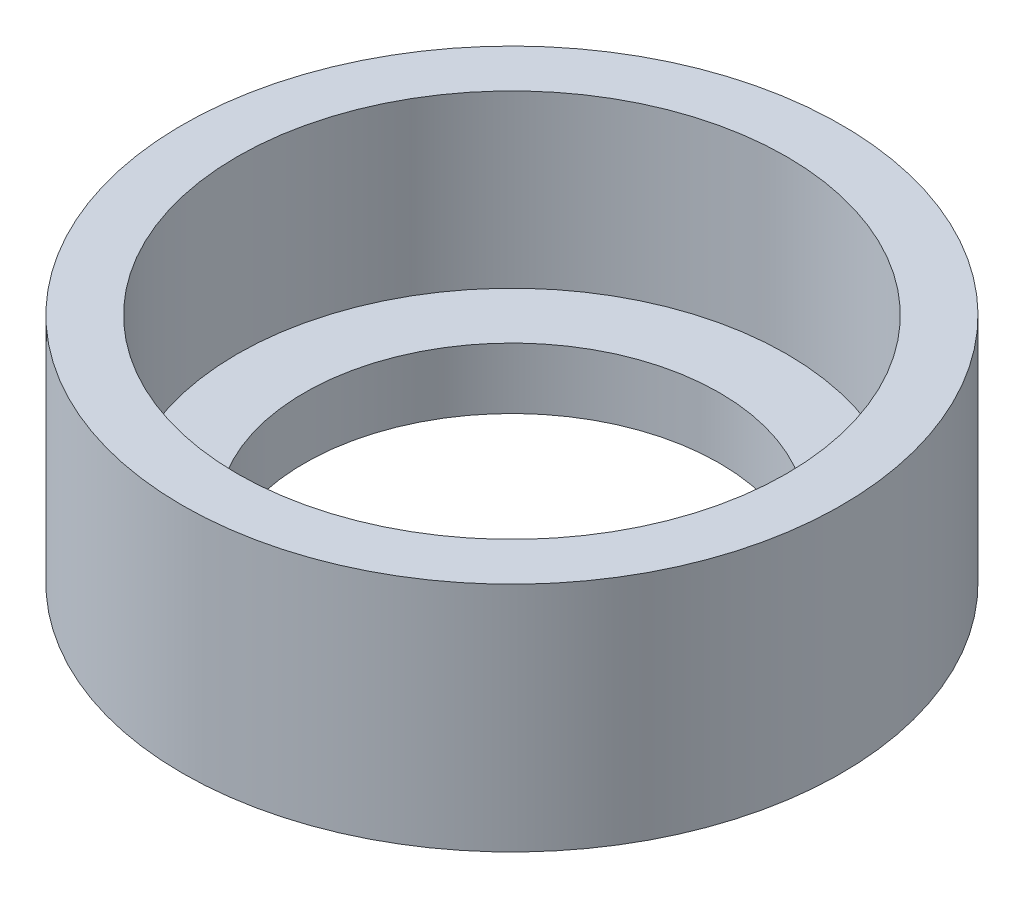
ISO-10303-21;
HEADER;
FILE_DESCRIPTION(('STEP AP214'),'2;1');
FILE_NAME('part.step','',(''),(''),'','','');
FILE_SCHEMA(('AUTOMOTIVE_DESIGN { 1 0 10303 214 1 1 1 1 }'));
ENDSEC;
DATA;
#1=APPLICATION_CONTEXT('core data for automotive mechanical design processes');
#2=APPLICATION_PROTOCOL_DEFINITION('international standard','automotive_design',2000,#1);
#3=PRODUCT_CONTEXT('',#1,'mechanical');
#4=PRODUCT('Part','Part','',(#3));
#5=PRODUCT_RELATED_PRODUCT_CATEGORY('part','',(#4));
#6=PRODUCT_DEFINITION_FORMATION('','',#4);
#7=PRODUCT_DEFINITION_CONTEXT('part definition',#1,'design');
#8=PRODUCT_DEFINITION('design','',#6,#7);
#9=PRODUCT_DEFINITION_SHAPE('','',#8);
#10=(LENGTH_UNIT() NAMED_UNIT(*) SI_UNIT(.MILLI.,.METRE.));
#11=(NAMED_UNIT(*) PLANE_ANGLE_UNIT() SI_UNIT($,.RADIAN.));
#12=(NAMED_UNIT(*) SI_UNIT($,.STERADIAN.) SOLID_ANGLE_UNIT());
#13=UNCERTAINTY_MEASURE_WITH_UNIT(LENGTH_MEASURE(1.E-05),#10,'distance_accuracy_value','');
#14=(GEOMETRIC_REPRESENTATION_CONTEXT(3) GLOBAL_UNCERTAINTY_ASSIGNED_CONTEXT((#13)) GLOBAL_UNIT_ASSIGNED_CONTEXT((#10,
#11,#12)) REPRESENTATION_CONTEXT('',''));
#15=CARTESIAN_POINT('',(0.,0.,0.));
#16=DIRECTION('',(0.,0.,1.));
#17=DIRECTION('',(1.,0.,0.));
#18=AXIS2_PLACEMENT_3D('',#15,#16,#17);
#19=CARTESIAN_POINT('',(0.,9.5,0.));
#20=DIRECTION('',(0.,-1.,0.));
#21=DIRECTION('',(0.,0.,-1.));
#22=AXIS2_PLACEMENT_3D('',#19,#20,#21);
#23=CYLINDRICAL_SURFACE('',#22,8.5);
#24=CARTESIAN_POINT('',(0.,0.,0.));
#25=DIRECTION('',(0.,1.,0.));
#26=DIRECTION('',(0.,0.,1.));
#27=AXIS2_PLACEMENT_3D('',#24,#25,#26);
#28=CIRCLE('',#27,8.5);
#29=CARTESIAN_POINT('',(0.,0.,8.5));
#30=VERTEX_POINT('',#29);
#31=EDGE_CURVE('E44',#30,#30,#28,.T.);
#32=ORIENTED_EDGE('',*,*,#31,.F.);
#33=EDGE_LOOP('',(#32));
#34=FACE_BOUND('',#33,.T.);
#35=CARTESIAN_POINT('',(0.,2.5,0.));
#36=DIRECTION('',(0.,1.,0.));
#37=DIRECTION('',(0.,0.,1.));
#38=AXIS2_PLACEMENT_3D('',#35,#36,#37);
#39=CIRCLE('',#38,8.5);
#40=CARTESIAN_POINT('',(0.,2.5,8.5));
#41=VERTEX_POINT('',#40);
#42=EDGE_CURVE('E35',#41,#41,#39,.T.);
#43=ORIENTED_EDGE('',*,*,#42,.T.);
#44=EDGE_LOOP('',(#43));
#45=FACE_BOUND('',#44,.T.);
#46=ADVANCED_FACE('F31',(#34,#45),#23,.F.);
#47=CARTESIAN_POINT('',(0.,9.5,0.));
#48=DIRECTION('',(0.,1.,0.));
#49=DIRECTION('',(0.,0.,1.));
#50=AXIS2_PLACEMENT_3D('',#47,#48,#49);
#51=PLANE('',#50);
#52=CARTESIAN_POINT('',(0.,9.5,0.));
#53=DIRECTION('',(0.,1.,0.));
#54=DIRECTION('',(0.,0.,1.));
#55=AXIS2_PLACEMENT_3D('',#52,#53,#54);
#56=CIRCLE('',#55,11.25);
#57=CARTESIAN_POINT('',(0.,9.5,11.25));
#58=VERTEX_POINT('',#57);
#59=EDGE_CURVE('E48',#58,#58,#56,.T.);
#60=ORIENTED_EDGE('',*,*,#59,.F.);
#61=EDGE_LOOP('',(#60));
#62=FACE_BOUND('',#61,.T.);
#63=CARTESIAN_POINT('',(0.,9.5,0.));
#64=DIRECTION('',(0.,1.,0.));
#65=DIRECTION('',(0.,0.,1.));
#66=AXIS2_PLACEMENT_3D('',#63,#64,#65);
#67=CIRCLE('',#66,13.5);
#68=CARTESIAN_POINT('',(0.,9.5,13.5));
#69=VERTEX_POINT('',#68);
#70=EDGE_CURVE('E10',#69,#69,#67,.T.);
#71=ORIENTED_EDGE('',*,*,#70,.T.);
#72=EDGE_LOOP('',(#71));
#73=FACE_BOUND('',#72,.T.);
#74=ADVANCED_FACE('F69',(#62,#73),#51,.T.);
#75=CARTESIAN_POINT('',(0.,0.,0.));
#76=DIRECTION('',(0.,1.,0.));
#77=DIRECTION('',(0.,0.,1.));
#78=AXIS2_PLACEMENT_3D('',#75,#76,#77);
#79=PLANE('',#78);
#80=CARTESIAN_POINT('',(0.,0.,0.));
#81=DIRECTION('',(0.,1.,0.));
#82=DIRECTION('',(0.,0.,1.));
#83=AXIS2_PLACEMENT_3D('',#80,#81,#82);
#84=CIRCLE('',#83,13.5);
#85=CARTESIAN_POINT('',(0.,0.,13.5));
#86=VERTEX_POINT('',#85);
#87=EDGE_CURVE('E39',#86,#86,#84,.T.);
#88=ORIENTED_EDGE('',*,*,#87,.F.);
#89=EDGE_LOOP('',(#88));
#90=FACE_BOUND('',#89,.T.);
#91=ORIENTED_EDGE('',*,*,#31,.T.);
#92=EDGE_LOOP('',(#91));
#93=FACE_BOUND('',#92,.T.);
#94=ADVANCED_FACE('F75',(#90,#93),#79,.F.);
#95=CARTESIAN_POINT('',(0.,9.5,0.));
#96=DIRECTION('',(0.,-1.,0.));
#97=DIRECTION('',(0.,0.,-1.));
#98=AXIS2_PLACEMENT_3D('',#95,#96,#97);
#99=CYLINDRICAL_SURFACE('',#98,13.5);
#100=ORIENTED_EDGE('',*,*,#70,.F.);
#101=EDGE_LOOP('',(#100));
#102=FACE_BOUND('',#101,.T.);
#103=ORIENTED_EDGE('',*,*,#87,.T.);
#104=EDGE_LOOP('',(#103));
#105=FACE_BOUND('',#104,.T.);
#106=ADVANCED_FACE('F33',(#102,#105),#99,.T.);
#107=CARTESIAN_POINT('',(0.,2.5,0.));
#108=DIRECTION('',(0.,1.,0.));
#109=DIRECTION('',(0.,0.,1.));
#110=AXIS2_PLACEMENT_3D('',#107,#108,#109);
#111=CYLINDRICAL_SURFACE('',#110,11.25);
#112=CARTESIAN_POINT('',(0.,2.5,0.));
#113=DIRECTION('',(0.,1.,0.));
#114=DIRECTION('',(0.,0.,1.));
#115=AXIS2_PLACEMENT_3D('',#112,#113,#114);
#116=CIRCLE('',#115,11.25);
#117=CARTESIAN_POINT('',(0.,2.5,11.25));
#118=VERTEX_POINT('',#117);
#119=EDGE_CURVE('E51',#118,#118,#116,.T.);
#120=ORIENTED_EDGE('',*,*,#119,.F.);
#121=EDGE_LOOP('',(#120));
#122=FACE_BOUND('',#121,.T.);
#123=ORIENTED_EDGE('',*,*,#59,.T.);
#124=EDGE_LOOP('',(#123));
#125=FACE_BOUND('',#124,.T.);
#126=ADVANCED_FACE('F61',(#122,#125),#111,.F.);
#127=CARTESIAN_POINT('',(0.,2.5,0.));
#128=DIRECTION('',(0.,1.,0.));
#129=DIRECTION('',(0.,0.,1.));
#130=AXIS2_PLACEMENT_3D('',#127,#128,#129);
#131=PLANE('',#130);
#132=ORIENTED_EDGE('',*,*,#42,.F.);
#133=EDGE_LOOP('',(#132));
#134=FACE_BOUND('',#133,.T.);
#135=ORIENTED_EDGE('',*,*,#119,.T.);
#136=EDGE_LOOP('',(#135));
#137=FACE_BOUND('',#136,.T.);
#138=ADVANCED_FACE('F59',(#134,#137),#131,.T.);
#139=CLOSED_SHELL('',(#46,#74,#94,#106,#126,#138));
#140=MANIFOLD_SOLID_BREP('B2',#139);
#141=ADVANCED_BREP_SHAPE_REPRESENTATION('',(#18,#140),#14);
#142=SHAPE_DEFINITION_REPRESENTATION(#9,#141);
ENDSEC;
END-ISO-10303-21;
